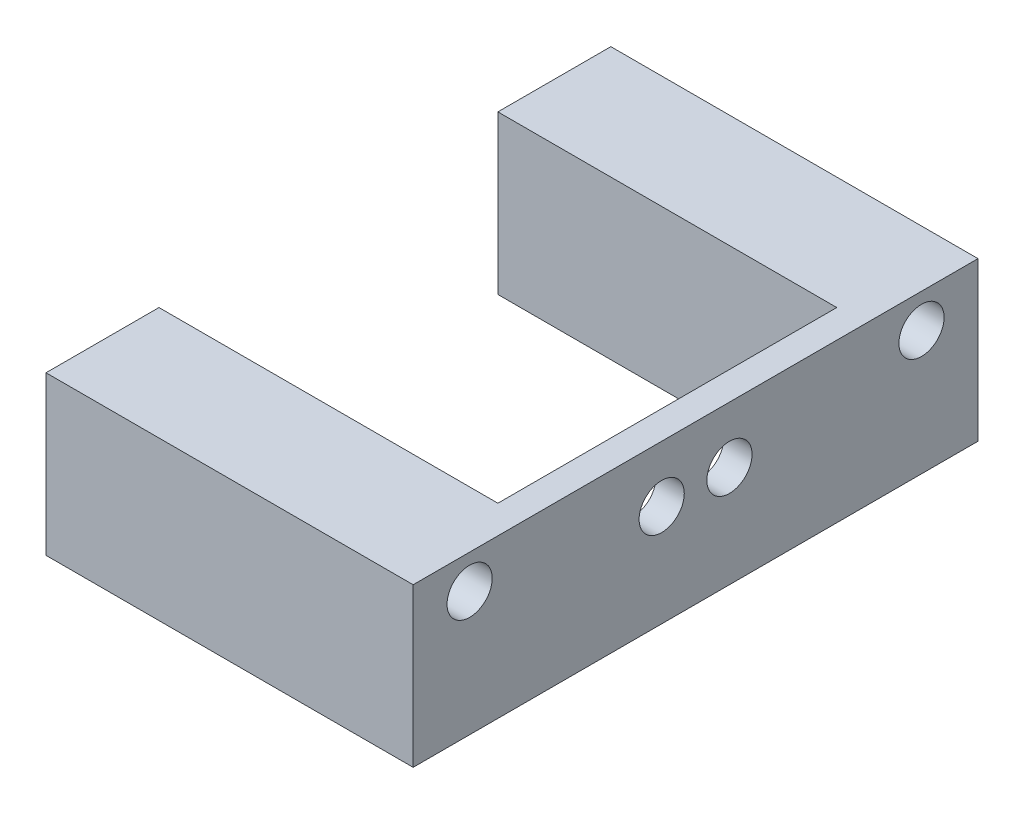
ISO-10303-21;
HEADER;
FILE_DESCRIPTION(('STEP AP214'),'2;1');
FILE_NAME('part.step','',(''),(''),'','','');
FILE_SCHEMA(('AUTOMOTIVE_DESIGN { 1 0 10303 214 1 1 1 1 }'));
ENDSEC;
DATA;
#1=APPLICATION_CONTEXT('core data for automotive mechanical design processes');
#2=APPLICATION_PROTOCOL_DEFINITION('international standard','automotive_design',2000,#1);
#3=PRODUCT_CONTEXT('',#1,'mechanical');
#4=PRODUCT('Part','Part','',(#3));
#5=PRODUCT_RELATED_PRODUCT_CATEGORY('part','',(#4));
#6=PRODUCT_DEFINITION_FORMATION('','',#4);
#7=PRODUCT_DEFINITION_CONTEXT('part definition',#1,'design');
#8=PRODUCT_DEFINITION('design','',#6,#7);
#9=PRODUCT_DEFINITION_SHAPE('','',#8);
#10=(LENGTH_UNIT() NAMED_UNIT(*) SI_UNIT(.MILLI.,.METRE.));
#11=(NAMED_UNIT(*) PLANE_ANGLE_UNIT() SI_UNIT($,.RADIAN.));
#12=(NAMED_UNIT(*) SI_UNIT($,.STERADIAN.) SOLID_ANGLE_UNIT());
#13=UNCERTAINTY_MEASURE_WITH_UNIT(LENGTH_MEASURE(1.E-05),#10,'distance_accuracy_value','');
#14=(GEOMETRIC_REPRESENTATION_CONTEXT(3) GLOBAL_UNCERTAINTY_ASSIGNED_CONTEXT((#13)) GLOBAL_UNIT_ASSIGNED_CONTEXT((#10,
#11,#12)) REPRESENTATION_CONTEXT('',''));
#15=CARTESIAN_POINT('',(0.,0.,0.));
#16=DIRECTION('',(0.,0.,1.));
#17=DIRECTION('',(1.,0.,0.));
#18=AXIS2_PLACEMENT_3D('',#15,#16,#17);
#19=CARTESIAN_POINT('',(0.,0.,0.));
#20=DIRECTION('',(1.,0.,0.));
#21=DIRECTION('',(0.,0.,-1.));
#22=AXIS2_PLACEMENT_3D('',#19,#20,#21);
#23=PLANE('',#22);
#24=CARTESIAN_POINT('',(0.,4.00000000000001,6.00000000000001));
#25=DIRECTION('',(1.,0.,0.));
#26=DIRECTION('',(0.,0.,-1.));
#27=AXIS2_PLACEMENT_3D('',#24,#25,#26);
#28=CIRCLE('',#27,4.);
#29=CARTESIAN_POINT('',(0.,4.00000000000001,2.00000000000001));
#30=VERTEX_POINT('',#29);
#31=EDGE_CURVE('E176',#30,#30,#28,.T.);
#32=ORIENTED_EDGE('',*,*,#31,.T.);
#33=EDGE_LOOP('',(#32));
#34=FACE_BOUND('',#33,.T.);
#35=CARTESIAN_POINT('',(0.,4.00000000000001,-5.99999999999999));
#36=DIRECTION('',(1.,0.,0.));
#37=DIRECTION('',(0.,0.,-1.));
#38=AXIS2_PLACEMENT_3D('',#35,#36,#37);
#39=CIRCLE('',#38,4.);
#40=CARTESIAN_POINT('',(0.,4.00000000000001,-9.99999999999999));
#41=VERTEX_POINT('',#40);
#42=EDGE_CURVE('E155',#41,#41,#39,.T.);
#43=ORIENTED_EDGE('',*,*,#42,.T.);
#44=EDGE_LOOP('',(#43));
#45=FACE_BOUND('',#44,.T.);
#46=DIRECTION('',(0.,-1.,0.));
#47=VECTOR('',#46,1.);
#48=CARTESIAN_POINT('',(0.,14.,30.0000000000005));
#49=LINE('',#48,#47);
#50=CARTESIAN_POINT('',(0.,14.,30.0000000000005));
#51=VERTEX_POINT('',#50);
#52=CARTESIAN_POINT('',(0.,-14.,30.0000000000005));
#53=VERTEX_POINT('',#52);
#54=EDGE_CURVE('E121',#51,#53,#49,.T.);
#55=ORIENTED_EDGE('',*,*,#54,.F.);
#56=DIRECTION('',(0.,0.,1.));
#57=VECTOR('',#56,1.);
#58=CARTESIAN_POINT('',(0.,14.,0.));
#59=LINE('',#58,#57);
#60=CARTESIAN_POINT('',(0.,14.,-29.9999999999995));
#61=VERTEX_POINT('',#60);
#62=EDGE_CURVE('E126',#61,#51,#59,.T.);
#63=ORIENTED_EDGE('',*,*,#62,.F.);
#64=DIRECTION('',(0.,1.,0.));
#65=VECTOR('',#64,1.);
#66=CARTESIAN_POINT('',(0.,14.,-29.9999999999995));
#67=LINE('',#66,#65);
#68=CARTESIAN_POINT('',(0.,-14.,-29.9999999999995));
#69=VERTEX_POINT('',#68);
#70=EDGE_CURVE('E50',#69,#61,#67,.T.);
#71=ORIENTED_EDGE('',*,*,#70,.F.);
#72=DIRECTION('',(0.,0.,1.));
#73=VECTOR('',#72,1.);
#74=CARTESIAN_POINT('',(0.,-14.,0.));
#75=LINE('',#74,#73);
#76=EDGE_CURVE('E150',#69,#53,#75,.T.);
#77=ORIENTED_EDGE('',*,*,#76,.T.);
#78=EDGE_LOOP('',(#55,#63,#71,#77));
#79=FACE_BOUND('',#78,.T.);
#80=ADVANCED_FACE('F35',(#34,#45,#79),#23,.F.);
#81=CARTESIAN_POINT('',(5.,0.,50.0000000000005));
#82=DIRECTION('',(0.,0.,1.));
#83=DIRECTION('',(1.,0.,0.));
#84=AXIS2_PLACEMENT_3D('',#81,#82,#83);
#85=PLANE('',#84);
#86=DIRECTION('',(-1.,0.,0.));
#87=VECTOR('',#86,1.);
#88=CARTESIAN_POINT('',(5.,14.,50.0000000000005));
#89=LINE('',#88,#87);
#90=CARTESIAN_POINT('',(5.,14.,50.0000000000005));
#91=VERTEX_POINT('',#90);
#92=CARTESIAN_POINT('',(-60.,14.,50.0000000000005));
#93=VERTEX_POINT('',#92);
#94=EDGE_CURVE('E173',#91,#93,#89,.T.);
#95=ORIENTED_EDGE('',*,*,#94,.T.);
#96=DIRECTION('',(0.,1.,0.));
#97=VECTOR('',#96,1.);
#98=CARTESIAN_POINT('',(-60.,-14.,50.0000000000005));
#99=LINE('',#98,#97);
#100=CARTESIAN_POINT('',(-60.,-14.,50.0000000000005));
#101=VERTEX_POINT('',#100);
#102=EDGE_CURVE('E119',#101,#93,#99,.T.);
#103=ORIENTED_EDGE('',*,*,#102,.F.);
#104=DIRECTION('',(-1.,0.,0.));
#105=VECTOR('',#104,1.);
#106=CARTESIAN_POINT('',(5.,-14.,50.0000000000005));
#107=LINE('',#106,#105);
#108=CARTESIAN_POINT('',(5.,-14.,50.0000000000005));
#109=VERTEX_POINT('',#108);
#110=EDGE_CURVE('E11',#109,#101,#107,.T.);
#111=ORIENTED_EDGE('',*,*,#110,.F.);
#112=DIRECTION('',(0.,1.,0.));
#113=VECTOR('',#112,1.);
#114=CARTESIAN_POINT('',(5.,0.,50.0000000000005));
#115=LINE('',#114,#113);
#116=EDGE_CURVE('E151',#109,#91,#115,.T.);
#117=ORIENTED_EDGE('',*,*,#116,.T.);
#118=EDGE_LOOP('',(#95,#103,#111,#117));
#119=FACE_BOUND('',#118,.T.);
#120=ADVANCED_FACE('F37',(#119),#85,.T.);
#121=CARTESIAN_POINT('',(5.,-14.,0.));
#122=DIRECTION('',(0.,-1.,0.));
#123=DIRECTION('',(0.,0.,-1.));
#124=AXIS2_PLACEMENT_3D('',#121,#122,#123);
#125=PLANE('',#124);
#126=ORIENTED_EDGE('',*,*,#76,.F.);
#127=DIRECTION('',(1.,0.,0.));
#128=VECTOR('',#127,1.);
#129=CARTESIAN_POINT('',(-60.,-14.,-29.9999999999995));
#130=LINE('',#129,#128);
#131=CARTESIAN_POINT('',(-60.,-14.,-29.9999999999995));
#132=VERTEX_POINT('',#131);
#133=EDGE_CURVE('E147',#132,#69,#130,.T.);
#134=ORIENTED_EDGE('',*,*,#133,.F.);
#135=DIRECTION('',(0.,0.,1.));
#136=VECTOR('',#135,1.);
#137=CARTESIAN_POINT('',(-60.,-14.,-49.9999999999995));
#138=LINE('',#137,#136);
#139=CARTESIAN_POINT('',(-60.,-14.,-49.9999999999995));
#140=VERTEX_POINT('',#139);
#141=EDGE_CURVE('E140',#140,#132,#138,.T.);
#142=ORIENTED_EDGE('',*,*,#141,.F.);
#143=DIRECTION('',(-1.,0.,0.));
#144=VECTOR('',#143,1.);
#145=CARTESIAN_POINT('',(5.,-14.,-49.9999999999995));
#146=LINE('',#145,#144);
#147=CARTESIAN_POINT('',(5.,-14.,-49.9999999999995));
#148=VERTEX_POINT('',#147);
#149=EDGE_CURVE('E43',#148,#140,#146,.T.);
#150=ORIENTED_EDGE('',*,*,#149,.F.);
#151=DIRECTION('',(0.,0.,1.));
#152=VECTOR('',#151,1.);
#153=CARTESIAN_POINT('',(5.,-14.,0.));
#154=LINE('',#153,#152);
#155=EDGE_CURVE('E154',#148,#109,#154,.T.);
#156=ORIENTED_EDGE('',*,*,#155,.T.);
#157=ORIENTED_EDGE('',*,*,#110,.T.);
#158=DIRECTION('',(0.,0.,1.));
#159=VECTOR('',#158,1.);
#160=CARTESIAN_POINT('',(-60.,-14.,30.0000000000005));
#161=LINE('',#160,#159);
#162=CARTESIAN_POINT('',(-60.,-14.,30.0000000000005));
#163=VERTEX_POINT('',#162);
#164=EDGE_CURVE('E111',#163,#101,#161,.T.);
#165=ORIENTED_EDGE('',*,*,#164,.F.);
#166=DIRECTION('',(1.,0.,0.));
#167=VECTOR('',#166,1.);
#168=CARTESIAN_POINT('',(-60.,-14.,30.0000000000005));
#169=LINE('',#168,#167);
#170=EDGE_CURVE('E107',#163,#53,#169,.T.);
#171=ORIENTED_EDGE('',*,*,#170,.T.);
#172=EDGE_LOOP('',(#126,#134,#142,#150,#156,#157,#165,#171));
#173=FACE_BOUND('',#172,.T.);
#174=ADVANCED_FACE('F196',(#173),#125,.T.);
#175=CARTESIAN_POINT('',(5.,0.,-49.9999999999995));
#176=DIRECTION('',(0.,0.,1.));
#177=DIRECTION('',(1.,0.,0.));
#178=AXIS2_PLACEMENT_3D('',#175,#176,#177);
#179=PLANE('',#178);
#180=ORIENTED_EDGE('',*,*,#149,.T.);
#181=DIRECTION('',(0.,-1.,0.));
#182=VECTOR('',#181,1.);
#183=CARTESIAN_POINT('',(-60.,14.,-49.9999999999995));
#184=LINE('',#183,#182);
#185=CARTESIAN_POINT('',(-60.,14.,-49.9999999999995));
#186=VERTEX_POINT('',#185);
#187=EDGE_CURVE('E137',#186,#140,#184,.T.);
#188=ORIENTED_EDGE('',*,*,#187,.F.);
#189=DIRECTION('',(-1.,0.,0.));
#190=VECTOR('',#189,1.);
#191=CARTESIAN_POINT('',(5.,14.,-49.9999999999995));
#192=LINE('',#191,#190);
#193=CARTESIAN_POINT('',(5.,14.,-49.9999999999995));
#194=VERTEX_POINT('',#193);
#195=EDGE_CURVE('E182',#194,#186,#192,.T.);
#196=ORIENTED_EDGE('',*,*,#195,.F.);
#197=DIRECTION('',(0.,1.,0.));
#198=VECTOR('',#197,1.);
#199=CARTESIAN_POINT('',(5.,0.,-49.9999999999995));
#200=LINE('',#199,#198);
#201=EDGE_CURVE('E158',#148,#194,#200,.T.);
#202=ORIENTED_EDGE('',*,*,#201,.F.);
#203=EDGE_LOOP('',(#180,#188,#196,#202));
#204=FACE_BOUND('',#203,.T.);
#205=ADVANCED_FACE('F186',(#204),#179,.F.);
#206=CARTESIAN_POINT('',(5.,8.00000000000001,40.0000000000005));
#207=DIRECTION('',(-1.,0.,0.));
#208=DIRECTION('',(0.,0.,1.));
#209=AXIS2_PLACEMENT_3D('',#206,#207,#208);
#210=CYLINDRICAL_SURFACE('',#209,4.00000000000001);
#211=CARTESIAN_POINT('',(5.,8.00000000000001,40.0000000000005));
#212=DIRECTION('',(1.,0.,0.));
#213=DIRECTION('',(0.,0.,-1.));
#214=AXIS2_PLACEMENT_3D('',#211,#212,#213);
#215=CIRCLE('',#214,4.00000000000001);
#216=CARTESIAN_POINT('',(5.,8.00000000000001,36.0000000000005));
#217=VERTEX_POINT('',#216);
#218=EDGE_CURVE('E167',#217,#217,#215,.T.);
#219=ORIENTED_EDGE('',*,*,#218,.T.);
#220=EDGE_LOOP('',(#219));
#221=FACE_BOUND('',#220,.T.);
#222=CARTESIAN_POINT('',(-60.,8.,40.0000000000005));
#223=DIRECTION('',(-1.,0.,0.));
#224=DIRECTION('',(0.,0.,1.));
#225=AXIS2_PLACEMENT_3D('',#222,#223,#224);
#226=CIRCLE('',#225,3.99999999999999);
#227=CARTESIAN_POINT('',(-60.,8.,44.0000000000005));
#228=VERTEX_POINT('',#227);
#229=EDGE_CURVE('E206',#228,#228,#226,.T.);
#230=ORIENTED_EDGE('',*,*,#229,.T.);
#231=EDGE_LOOP('',(#230));
#232=FACE_BOUND('',#231,.T.);
#233=ADVANCED_FACE('F211',(#221,#232),#210,.F.);
#234=CARTESIAN_POINT('',(5.,4.00000000000001,-5.99999999999999));
#235=DIRECTION('',(-1.,0.,0.));
#236=DIRECTION('',(0.,0.,1.));
#237=AXIS2_PLACEMENT_3D('',#234,#235,#236);
#238=CYLINDRICAL_SURFACE('',#237,4.);
#239=CARTESIAN_POINT('',(5.,4.00000000000001,-5.99999999999999));
#240=DIRECTION('',(1.,0.,0.));
#241=DIRECTION('',(0.,0.,-1.));
#242=AXIS2_PLACEMENT_3D('',#239,#240,#241);
#243=CIRCLE('',#242,4.);
#244=CARTESIAN_POINT('',(5.,4.00000000000001,-9.99999999999999));
#245=VERTEX_POINT('',#244);
#246=EDGE_CURVE('E164',#245,#245,#243,.T.);
#247=ORIENTED_EDGE('',*,*,#246,.T.);
#248=EDGE_LOOP('',(#247));
#249=FACE_BOUND('',#248,.T.);
#250=ORIENTED_EDGE('',*,*,#42,.F.);
#251=EDGE_LOOP('',(#250));
#252=FACE_BOUND('',#251,.T.);
#253=ADVANCED_FACE('F237',(#249,#252),#238,.F.);
#254=CARTESIAN_POINT('',(5.,4.00000000000001,6.00000000000001));
#255=DIRECTION('',(-1.,0.,0.));
#256=DIRECTION('',(0.,0.,1.));
#257=AXIS2_PLACEMENT_3D('',#254,#255,#256);
#258=CYLINDRICAL_SURFACE('',#257,4.);
#259=CARTESIAN_POINT('',(5.,4.00000000000001,6.00000000000001));
#260=DIRECTION('',(1.,0.,0.));
#261=DIRECTION('',(0.,0.,-1.));
#262=AXIS2_PLACEMENT_3D('',#259,#260,#261);
#263=CIRCLE('',#262,4.);
#264=CARTESIAN_POINT('',(5.,4.00000000000001,2.00000000000001));
#265=VERTEX_POINT('',#264);
#266=EDGE_CURVE('E161',#265,#265,#263,.T.);
#267=ORIENTED_EDGE('',*,*,#266,.T.);
#268=EDGE_LOOP('',(#267));
#269=FACE_BOUND('',#268,.T.);
#270=ORIENTED_EDGE('',*,*,#31,.F.);
#271=EDGE_LOOP('',(#270));
#272=FACE_BOUND('',#271,.T.);
#273=ADVANCED_FACE('F241',(#269,#272),#258,.F.);
#274=CARTESIAN_POINT('',(5.,14.,0.));
#275=DIRECTION('',(0.,-1.,0.));
#276=DIRECTION('',(0.,0.,-1.));
#277=AXIS2_PLACEMENT_3D('',#274,#275,#276);
#278=PLANE('',#277);
#279=ORIENTED_EDGE('',*,*,#195,.T.);
#280=DIRECTION('',(0.,0.,-1.));
#281=VECTOR('',#280,1.);
#282=CARTESIAN_POINT('',(-60.,14.,-29.9999999999995));
#283=LINE('',#282,#281);
#284=CARTESIAN_POINT('',(-60.,14.,-29.9999999999995));
#285=VERTEX_POINT('',#284);
#286=EDGE_CURVE('E134',#285,#186,#283,.T.);
#287=ORIENTED_EDGE('',*,*,#286,.F.);
#288=DIRECTION('',(1.,0.,0.));
#289=VECTOR('',#288,1.);
#290=CARTESIAN_POINT('',(-60.,14.,-29.9999999999995));
#291=LINE('',#290,#289);
#292=EDGE_CURVE('E144',#285,#61,#291,.T.);
#293=ORIENTED_EDGE('',*,*,#292,.T.);
#294=ORIENTED_EDGE('',*,*,#62,.T.);
#295=DIRECTION('',(1.,0.,0.));
#296=VECTOR('',#295,1.);
#297=CARTESIAN_POINT('',(-60.,14.,30.0000000000005));
#298=LINE('',#297,#296);
#299=CARTESIAN_POINT('',(-60.,14.,30.0000000000005));
#300=VERTEX_POINT('',#299);
#301=EDGE_CURVE('E104',#300,#51,#298,.T.);
#302=ORIENTED_EDGE('',*,*,#301,.F.);
#303=DIRECTION('',(0.,0.,-1.));
#304=VECTOR('',#303,1.);
#305=CARTESIAN_POINT('',(-60.,14.,50.0000000000005));
#306=LINE('',#305,#304);
#307=EDGE_CURVE('E112',#93,#300,#306,.T.);
#308=ORIENTED_EDGE('',*,*,#307,.F.);
#309=ORIENTED_EDGE('',*,*,#94,.F.);
#310=DIRECTION('',(0.,0.,1.));
#311=VECTOR('',#310,1.);
#312=CARTESIAN_POINT('',(5.,14.,0.));
#313=LINE('',#312,#311);
#314=EDGE_CURVE('E58',#194,#91,#313,.T.);
#315=ORIENTED_EDGE('',*,*,#314,.F.);
#316=EDGE_LOOP('',(#279,#287,#293,#294,#302,#308,#309,#315));
#317=FACE_BOUND('',#316,.T.);
#318=ADVANCED_FACE('F124',(#317),#278,.F.);
#319=CARTESIAN_POINT('',(5.,8.00000000000001,-39.9999999999995));
#320=DIRECTION('',(-1.,0.,0.));
#321=DIRECTION('',(0.,0.,1.));
#322=AXIS2_PLACEMENT_3D('',#319,#320,#321);
#323=CYLINDRICAL_SURFACE('',#322,4.00000000000001);
#324=CARTESIAN_POINT('',(5.,8.00000000000001,-39.9999999999995));
#325=DIRECTION('',(1.,0.,0.));
#326=DIRECTION('',(0.,0.,-1.));
#327=AXIS2_PLACEMENT_3D('',#324,#325,#326);
#328=CIRCLE('',#327,4.00000000000001);
#329=CARTESIAN_POINT('',(5.,8.00000000000001,-43.9999999999995));
#330=VERTEX_POINT('',#329);
#331=EDGE_CURVE('E170',#330,#330,#328,.T.);
#332=ORIENTED_EDGE('',*,*,#331,.T.);
#333=EDGE_LOOP('',(#332));
#334=FACE_BOUND('',#333,.T.);
#335=CARTESIAN_POINT('',(-60.,8.00000000000002,-39.9999999999995));
#336=DIRECTION('',(-1.,0.,0.));
#337=DIRECTION('',(0.,0.,1.));
#338=AXIS2_PLACEMENT_3D('',#335,#336,#337);
#339=CIRCLE('',#338,4.00000000000001);
#340=CARTESIAN_POINT('',(-60.,8.00000000000002,-35.9999999999995));
#341=VERTEX_POINT('',#340);
#342=EDGE_CURVE('E127',#341,#341,#339,.T.);
#343=ORIENTED_EDGE('',*,*,#342,.T.);
#344=EDGE_LOOP('',(#343));
#345=FACE_BOUND('',#344,.T.);
#346=ADVANCED_FACE('F231',(#334,#345),#323,.F.);
#347=CARTESIAN_POINT('',(5.,0.,0.));
#348=DIRECTION('',(1.,0.,0.));
#349=DIRECTION('',(0.,0.,-1.));
#350=AXIS2_PLACEMENT_3D('',#347,#348,#349);
#351=PLANE('',#350);
#352=ORIENTED_EDGE('',*,*,#116,.F.);
#353=ORIENTED_EDGE('',*,*,#155,.F.);
#354=ORIENTED_EDGE('',*,*,#201,.T.);
#355=ORIENTED_EDGE('',*,*,#314,.T.);
#356=EDGE_LOOP('',(#352,#353,#354,#355));
#357=FACE_BOUND('',#356,.T.);
#358=ORIENTED_EDGE('',*,*,#266,.F.);
#359=EDGE_LOOP('',(#358));
#360=FACE_BOUND('',#359,.T.);
#361=ORIENTED_EDGE('',*,*,#246,.F.);
#362=EDGE_LOOP('',(#361));
#363=FACE_BOUND('',#362,.T.);
#364=ORIENTED_EDGE('',*,*,#218,.F.);
#365=EDGE_LOOP('',(#364));
#366=FACE_BOUND('',#365,.T.);
#367=ORIENTED_EDGE('',*,*,#331,.F.);
#368=EDGE_LOOP('',(#367));
#369=FACE_BOUND('',#368,.T.);
#370=ADVANCED_FACE('F202',(#357,#360,#363,#366,#369),#351,.T.);
#371=CARTESIAN_POINT('',(-60.,0.,0.));
#372=DIRECTION('',(-1.,0.,0.));
#373=DIRECTION('',(0.,0.,1.));
#374=AXIS2_PLACEMENT_3D('',#371,#372,#373);
#375=PLANE('',#374);
#376=ORIENTED_EDGE('',*,*,#286,.T.);
#377=ORIENTED_EDGE('',*,*,#187,.T.);
#378=ORIENTED_EDGE('',*,*,#141,.T.);
#379=DIRECTION('',(0.,1.,0.));
#380=VECTOR('',#379,1.);
#381=CARTESIAN_POINT('',(-60.,14.,-29.9999999999995));
#382=LINE('',#381,#380);
#383=EDGE_CURVE('E142',#132,#285,#382,.T.);
#384=ORIENTED_EDGE('',*,*,#383,.T.);
#385=EDGE_LOOP('',(#376,#377,#378,#384));
#386=FACE_BOUND('',#385,.T.);
#387=ORIENTED_EDGE('',*,*,#342,.F.);
#388=EDGE_LOOP('',(#387));
#389=FACE_BOUND('',#388,.T.);
#390=ADVANCED_FACE('F192',(#386,#389),#375,.T.);
#391=CARTESIAN_POINT('',(-60.,14.,-29.9999999999995));
#392=DIRECTION('',(0.,0.,-1.));
#393=DIRECTION('',(-1.,0.,0.));
#394=AXIS2_PLACEMENT_3D('',#391,#392,#393);
#395=PLANE('',#394);
#396=ORIENTED_EDGE('',*,*,#70,.T.);
#397=ORIENTED_EDGE('',*,*,#292,.F.);
#398=ORIENTED_EDGE('',*,*,#383,.F.);
#399=ORIENTED_EDGE('',*,*,#133,.T.);
#400=EDGE_LOOP('',(#396,#397,#398,#399));
#401=FACE_BOUND('',#400,.T.);
#402=ADVANCED_FACE('F200',(#401),#395,.F.);
#403=CARTESIAN_POINT('',(-60.,0.,0.));
#404=DIRECTION('',(-1.,0.,0.));
#405=DIRECTION('',(0.,0.,1.));
#406=AXIS2_PLACEMENT_3D('',#403,#404,#405);
#407=PLANE('',#406);
#408=ORIENTED_EDGE('',*,*,#307,.T.);
#409=DIRECTION('',(0.,-1.,0.));
#410=VECTOR('',#409,1.);
#411=CARTESIAN_POINT('',(-60.,14.,30.0000000000005));
#412=LINE('',#411,#410);
#413=EDGE_CURVE('E100',#300,#163,#412,.T.);
#414=ORIENTED_EDGE('',*,*,#413,.T.);
#415=ORIENTED_EDGE('',*,*,#164,.T.);
#416=ORIENTED_EDGE('',*,*,#102,.T.);
#417=EDGE_LOOP('',(#408,#414,#415,#416));
#418=FACE_BOUND('',#417,.T.);
#419=ORIENTED_EDGE('',*,*,#229,.F.);
#420=EDGE_LOOP('',(#419));
#421=FACE_BOUND('',#420,.T.);
#422=ADVANCED_FACE('F116',(#418,#421),#407,.T.);
#423=CARTESIAN_POINT('',(-60.,14.,30.0000000000005));
#424=DIRECTION('',(0.,0.,1.));
#425=DIRECTION('',(1.,0.,0.));
#426=AXIS2_PLACEMENT_3D('',#423,#424,#425);
#427=PLANE('',#426);
#428=ORIENTED_EDGE('',*,*,#54,.T.);
#429=ORIENTED_EDGE('',*,*,#170,.F.);
#430=ORIENTED_EDGE('',*,*,#413,.F.);
#431=ORIENTED_EDGE('',*,*,#301,.T.);
#432=EDGE_LOOP('',(#428,#429,#430,#431));
#433=FACE_BOUND('',#432,.T.);
#434=ADVANCED_FACE('F102',(#433),#427,.F.);
#435=CLOSED_SHELL('',(#80,#120,#174,#205,#233,#253,#273,#318,#346,#370,#390,#402,#422,#434));
#436=MANIFOLD_SOLID_BREP('B2',#435);
#437=ADVANCED_BREP_SHAPE_REPRESENTATION('',(#18,#436),#14);
#438=SHAPE_DEFINITION_REPRESENTATION(#9,#437);
ENDSEC;
END-ISO-10303-21;
